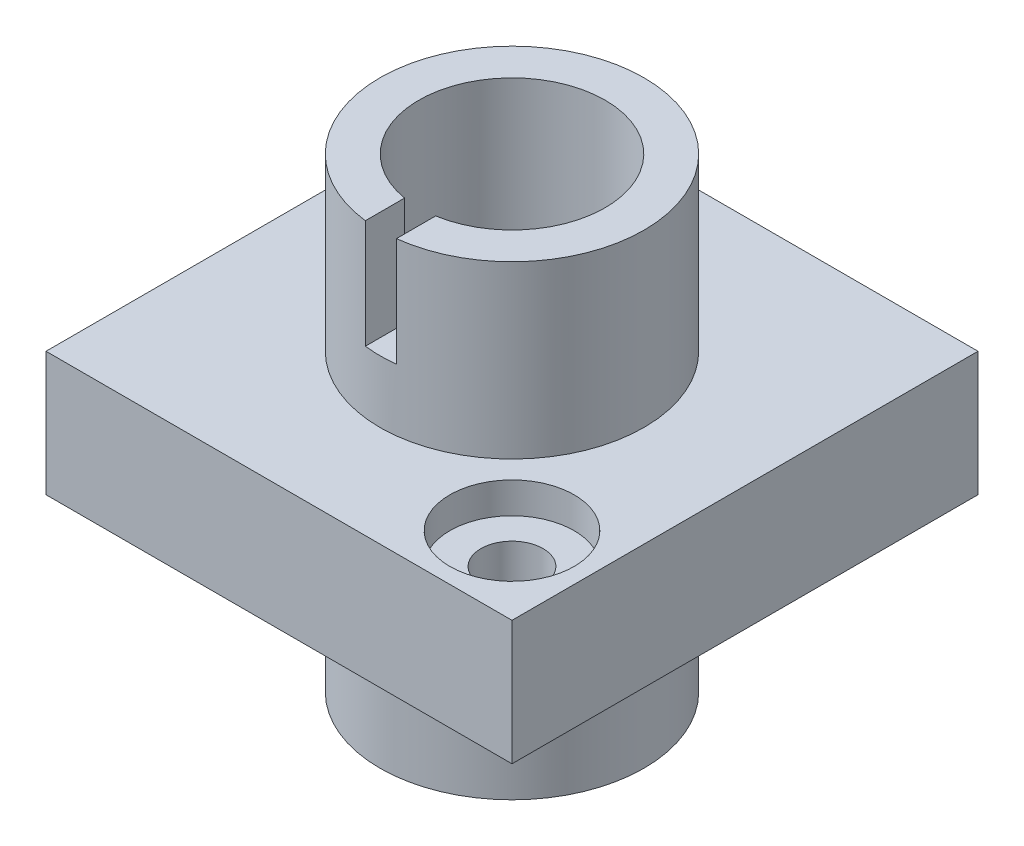
ISO-10303-21;
HEADER;
FILE_DESCRIPTION(('STEP AP214'),'2;1');
FILE_NAME('part.step','',(''),(''),'','','');
FILE_SCHEMA(('AUTOMOTIVE_DESIGN { 1 0 10303 214 1 1 1 1 }'));
ENDSEC;
DATA;
#1=APPLICATION_CONTEXT('core data for automotive mechanical design processes');
#2=APPLICATION_PROTOCOL_DEFINITION('international standard','automotive_design',2000,#1);
#3=PRODUCT_CONTEXT('',#1,'mechanical');
#4=PRODUCT('Part','Part','',(#3));
#5=PRODUCT_RELATED_PRODUCT_CATEGORY('part','',(#4));
#6=PRODUCT_DEFINITION_FORMATION('','',#4);
#7=PRODUCT_DEFINITION_CONTEXT('part definition',#1,'design');
#8=PRODUCT_DEFINITION('design','',#6,#7);
#9=PRODUCT_DEFINITION_SHAPE('','',#8);
#10=(LENGTH_UNIT() NAMED_UNIT(*) SI_UNIT(.MILLI.,.METRE.));
#11=(NAMED_UNIT(*) PLANE_ANGLE_UNIT() SI_UNIT($,.RADIAN.));
#12=(NAMED_UNIT(*) SI_UNIT($,.STERADIAN.) SOLID_ANGLE_UNIT());
#13=UNCERTAINTY_MEASURE_WITH_UNIT(LENGTH_MEASURE(1.E-05),#10,'distance_accuracy_value','');
#14=(GEOMETRIC_REPRESENTATION_CONTEXT(3) GLOBAL_UNCERTAINTY_ASSIGNED_CONTEXT((#13)) GLOBAL_UNIT_ASSIGNED_CONTEXT((#10,
#11,#12)) REPRESENTATION_CONTEXT('',''));
#15=CARTESIAN_POINT('',(0.,0.,0.));
#16=DIRECTION('',(0.,0.,1.));
#17=DIRECTION('',(1.,0.,0.));
#18=AXIS2_PLACEMENT_3D('',#15,#16,#17);
#19=CARTESIAN_POINT('',(-5.,-5.5,-5.));
#20=DIRECTION('',(0.,1.,0.));
#21=DIRECTION('',(0.,0.,1.));
#22=AXIS2_PLACEMENT_3D('',#19,#20,#21);
#23=CYLINDRICAL_SURFACE('',#22,1.);
#24=CARTESIAN_POINT('',(-5.,0.,-5.));
#25=DIRECTION('',(0.,1.,0.));
#26=DIRECTION('',(0.,0.,1.));
#27=AXIS2_PLACEMENT_3D('',#24,#25,#26);
#28=CIRCLE('',#27,1.);
#29=CARTESIAN_POINT('',(-5.,0.,-4.));
#30=VERTEX_POINT('',#29);
#31=EDGE_CURVE('E141',#30,#30,#28,.T.);
#32=ORIENTED_EDGE('',*,*,#31,.F.);
#33=EDGE_LOOP('',(#32));
#34=FACE_BOUND('',#33,.T.);
#35=CARTESIAN_POINT('',(-5.,3.,-5.));
#36=DIRECTION('',(0.,1.,0.));
#37=DIRECTION('',(0.,0.,1.));
#38=AXIS2_PLACEMENT_3D('',#35,#36,#37);
#39=CIRCLE('',#38,1.);
#40=CARTESIAN_POINT('',(-5.,3.,-4.));
#41=VERTEX_POINT('',#40);
#42=EDGE_CURVE('E129',#41,#41,#39,.F.);
#43=ORIENTED_EDGE('',*,*,#42,.F.);
#44=EDGE_LOOP('',(#43));
#45=FACE_BOUND('',#44,.T.);
#46=ADVANCED_FACE('F35',(#34,#45),#23,.F.);
#47=CARTESIAN_POINT('',(5.,-5.5,5.));
#48=DIRECTION('',(0.,1.,0.));
#49=DIRECTION('',(0.,0.,1.));
#50=AXIS2_PLACEMENT_3D('',#47,#48,#49);
#51=CYLINDRICAL_SURFACE('',#50,1.);
#52=CARTESIAN_POINT('',(5.,0.,5.));
#53=DIRECTION('',(0.,1.,0.));
#54=DIRECTION('',(0.,0.,1.));
#55=AXIS2_PLACEMENT_3D('',#52,#53,#54);
#56=CIRCLE('',#55,1.);
#57=CARTESIAN_POINT('',(5.,0.,6.));
#58=VERTEX_POINT('',#57);
#59=EDGE_CURVE('E185',#58,#58,#56,.T.);
#60=ORIENTED_EDGE('',*,*,#59,.F.);
#61=EDGE_LOOP('',(#60));
#62=FACE_BOUND('',#61,.T.);
#63=CARTESIAN_POINT('',(5.,3.,5.));
#64=DIRECTION('',(0.,1.,0.));
#65=DIRECTION('',(0.,0.,1.));
#66=AXIS2_PLACEMENT_3D('',#63,#64,#65);
#67=CIRCLE('',#66,1.);
#68=CARTESIAN_POINT('',(5.,3.,6.));
#69=VERTEX_POINT('',#68);
#70=EDGE_CURVE('E136',#69,#69,#67,.F.);
#71=ORIENTED_EDGE('',*,*,#70,.F.);
#72=EDGE_LOOP('',(#71));
#73=FACE_BOUND('',#72,.T.);
#74=ADVANCED_FACE('F219',(#62,#73),#51,.F.);
#75=CARTESIAN_POINT('',(-7.5,4.,7.5));
#76=DIRECTION('',(0.,1.,0.));
#77=DIRECTION('',(0.,0.,1.));
#78=AXIS2_PLACEMENT_3D('',#75,#76,#77);
#79=PLANE('',#78);
#80=CARTESIAN_POINT('',(-5.,4.,-5.));
#81=DIRECTION('',(0.,1.,0.));
#82=DIRECTION('',(0.,0.,1.));
#83=AXIS2_PLACEMENT_3D('',#80,#81,#82);
#84=CIRCLE('',#83,2.);
#85=CARTESIAN_POINT('',(-5.,4.,-3.));
#86=VERTEX_POINT('',#85);
#87=EDGE_CURVE('E120',#86,#86,#84,.T.);
#88=ORIENTED_EDGE('',*,*,#87,.F.);
#89=EDGE_LOOP('',(#88));
#90=FACE_BOUND('',#89,.T.);
#91=CARTESIAN_POINT('',(5.,4.,5.));
#92=DIRECTION('',(0.,1.,0.));
#93=DIRECTION('',(0.,0.,1.));
#94=AXIS2_PLACEMENT_3D('',#91,#92,#93);
#95=CIRCLE('',#94,2.);
#96=CARTESIAN_POINT('',(5.,4.,7.));
#97=VERTEX_POINT('',#96);
#98=EDGE_CURVE('E130',#97,#97,#95,.T.);
#99=ORIENTED_EDGE('',*,*,#98,.F.);
#100=EDGE_LOOP('',(#99));
#101=FACE_BOUND('',#100,.T.);
#102=DIRECTION('',(0.,0.,1.));
#103=VECTOR('',#102,1.);
#104=CARTESIAN_POINT('',(-7.5,4.,-7.5));
#105=LINE('',#104,#103);
#106=CARTESIAN_POINT('',(-7.5,4.,-7.5));
#107=VERTEX_POINT('',#106);
#108=CARTESIAN_POINT('',(-7.5,4.,7.5));
#109=VERTEX_POINT('',#108);
#110=EDGE_CURVE('E160',#107,#109,#105,.T.);
#111=ORIENTED_EDGE('',*,*,#110,.T.);
#112=DIRECTION('',(1.,0.,0.));
#113=VECTOR('',#112,1.);
#114=CARTESIAN_POINT('',(-7.5,4.,7.5));
#115=LINE('',#114,#113);
#116=CARTESIAN_POINT('',(7.5,4.,7.5));
#117=VERTEX_POINT('',#116);
#118=EDGE_CURVE('E162',#109,#117,#115,.T.);
#119=ORIENTED_EDGE('',*,*,#118,.T.);
#120=DIRECTION('',(0.,0.,-1.));
#121=VECTOR('',#120,1.);
#122=CARTESIAN_POINT('',(7.5,4.,-7.5));
#123=LINE('',#122,#121);
#124=CARTESIAN_POINT('',(7.5,4.,-7.5));
#125=VERTEX_POINT('',#124);
#126=EDGE_CURVE('E164',#117,#125,#123,.T.);
#127=ORIENTED_EDGE('',*,*,#126,.T.);
#128=DIRECTION('',(-1.,0.,0.));
#129=VECTOR('',#128,1.);
#130=CARTESIAN_POINT('',(-7.5,4.,-7.5));
#131=LINE('',#130,#129);
#132=EDGE_CURVE('E58',#125,#107,#131,.T.);
#133=ORIENTED_EDGE('',*,*,#132,.T.);
#134=EDGE_LOOP('',(#111,#119,#127,#133));
#135=FACE_BOUND('',#134,.T.);
#136=CARTESIAN_POINT('',(0.,4.,0.));
#137=DIRECTION('',(0.,1.,0.));
#138=DIRECTION('',(0.,0.,1.));
#139=AXIS2_PLACEMENT_3D('',#136,#137,#138);
#140=CIRCLE('',#139,4.25);
#141=CARTESIAN_POINT('',(0.,4.,4.25));
#142=VERTEX_POINT('',#141);
#143=EDGE_CURVE('E148',#142,#142,#140,.F.);
#144=ORIENTED_EDGE('',*,*,#143,.T.);
#145=EDGE_LOOP('',(#144));
#146=FACE_BOUND('',#145,.T.);
#147=ADVANCED_FACE('F225',(#90,#101,#135,#146),#79,.T.);
#148=CARTESIAN_POINT('',(-7.5,0.,7.5));
#149=DIRECTION('',(0.,1.,0.));
#150=DIRECTION('',(0.,0.,1.));
#151=AXIS2_PLACEMENT_3D('',#148,#149,#150);
#152=PLANE('',#151);
#153=ORIENTED_EDGE('',*,*,#59,.T.);
#154=EDGE_LOOP('',(#153));
#155=FACE_BOUND('',#154,.T.);
#156=ORIENTED_EDGE('',*,*,#31,.T.);
#157=EDGE_LOOP('',(#156));
#158=FACE_BOUND('',#157,.T.);
#159=DIRECTION('',(0.,0.,1.));
#160=VECTOR('',#159,1.);
#161=CARTESIAN_POINT('',(-7.5,0.,-7.5));
#162=LINE('',#161,#160);
#163=CARTESIAN_POINT('',(-7.5,0.,-7.5));
#164=VERTEX_POINT('',#163);
#165=CARTESIAN_POINT('',(-7.5,0.,7.5));
#166=VERTEX_POINT('',#165);
#167=EDGE_CURVE('E151',#164,#166,#162,.T.);
#168=ORIENTED_EDGE('',*,*,#167,.F.);
#169=DIRECTION('',(-1.,0.,0.));
#170=VECTOR('',#169,1.);
#171=CARTESIAN_POINT('',(-7.5,0.,-7.5));
#172=LINE('',#171,#170);
#173=CARTESIAN_POINT('',(7.5,0.,-7.5));
#174=VERTEX_POINT('',#173);
#175=EDGE_CURVE('E158',#174,#164,#172,.T.);
#176=ORIENTED_EDGE('',*,*,#175,.F.);
#177=DIRECTION('',(0.,0.,-1.));
#178=VECTOR('',#177,1.);
#179=CARTESIAN_POINT('',(7.5,0.,-7.5));
#180=LINE('',#179,#178);
#181=CARTESIAN_POINT('',(7.5,0.,7.5));
#182=VERTEX_POINT('',#181);
#183=EDGE_CURVE('E156',#182,#174,#180,.T.);
#184=ORIENTED_EDGE('',*,*,#183,.F.);
#185=DIRECTION('',(1.,0.,0.));
#186=VECTOR('',#185,1.);
#187=CARTESIAN_POINT('',(-7.5,0.,7.5));
#188=LINE('',#187,#186);
#189=EDGE_CURVE('E154',#166,#182,#188,.T.);
#190=ORIENTED_EDGE('',*,*,#189,.F.);
#191=EDGE_LOOP('',(#168,#176,#184,#190));
#192=FACE_BOUND('',#191,.T.);
#193=CARTESIAN_POINT('',(0.,0.,0.));
#194=DIRECTION('',(0.,1.,0.));
#195=DIRECTION('',(0.,0.,1.));
#196=AXIS2_PLACEMENT_3D('',#193,#194,#195);
#197=CIRCLE('',#196,4.25);
#198=CARTESIAN_POINT('',(0.,0.,4.25));
#199=VERTEX_POINT('',#198);
#200=EDGE_CURVE('E179',#199,#199,#197,.F.);
#201=ORIENTED_EDGE('',*,*,#200,.F.);
#202=EDGE_LOOP('',(#201));
#203=FACE_BOUND('',#202,.T.);
#204=ADVANCED_FACE('F249',(#155,#158,#192,#203),#152,.F.);
#205=CARTESIAN_POINT('',(-7.5,4.,-7.5));
#206=DIRECTION('',(1.,0.,0.));
#207=DIRECTION('',(0.,0.,-1.));
#208=AXIS2_PLACEMENT_3D('',#205,#206,#207);
#209=PLANE('',#208);
#210=ORIENTED_EDGE('',*,*,#167,.T.);
#211=DIRECTION('',(0.,-1.,0.));
#212=VECTOR('',#211,1.);
#213=CARTESIAN_POINT('',(-7.5,4.,7.5));
#214=LINE('',#213,#212);
#215=EDGE_CURVE('E176',#109,#166,#214,.T.);
#216=ORIENTED_EDGE('',*,*,#215,.F.);
#217=ORIENTED_EDGE('',*,*,#110,.F.);
#218=DIRECTION('',(0.,-1.,0.));
#219=VECTOR('',#218,1.);
#220=CARTESIAN_POINT('',(-7.5,4.,-7.5));
#221=LINE('',#220,#219);
#222=EDGE_CURVE('E167',#107,#164,#221,.T.);
#223=ORIENTED_EDGE('',*,*,#222,.T.);
#224=EDGE_LOOP('',(#210,#216,#217,#223));
#225=FACE_BOUND('',#224,.T.);
#226=ADVANCED_FACE('F37',(#225),#209,.F.);
#227=CARTESIAN_POINT('',(-7.5,4.,7.5));
#228=DIRECTION('',(0.,0.,-1.));
#229=DIRECTION('',(-1.,0.,0.));
#230=AXIS2_PLACEMENT_3D('',#227,#228,#229);
#231=PLANE('',#230);
#232=ORIENTED_EDGE('',*,*,#189,.T.);
#233=DIRECTION('',(0.,-1.,0.));
#234=VECTOR('',#233,1.);
#235=CARTESIAN_POINT('',(7.5,4.,7.5));
#236=LINE('',#235,#234);
#237=EDGE_CURVE('E173',#117,#182,#236,.T.);
#238=ORIENTED_EDGE('',*,*,#237,.F.);
#239=ORIENTED_EDGE('',*,*,#118,.F.);
#240=ORIENTED_EDGE('',*,*,#215,.T.);
#241=EDGE_LOOP('',(#232,#238,#239,#240));
#242=FACE_BOUND('',#241,.T.);
#243=ADVANCED_FACE('F257',(#242),#231,.F.);
#244=CARTESIAN_POINT('',(7.5,4.,-7.5));
#245=DIRECTION('',(-1.,0.,0.));
#246=DIRECTION('',(0.,0.,1.));
#247=AXIS2_PLACEMENT_3D('',#244,#245,#246);
#248=PLANE('',#247);
#249=ORIENTED_EDGE('',*,*,#183,.T.);
#250=DIRECTION('',(0.,-1.,0.));
#251=VECTOR('',#250,1.);
#252=CARTESIAN_POINT('',(7.5,4.,-7.5));
#253=LINE('',#252,#251);
#254=EDGE_CURVE('E170',#125,#174,#253,.T.);
#255=ORIENTED_EDGE('',*,*,#254,.F.);
#256=ORIENTED_EDGE('',*,*,#126,.F.);
#257=ORIENTED_EDGE('',*,*,#237,.T.);
#258=EDGE_LOOP('',(#249,#255,#256,#257));
#259=FACE_BOUND('',#258,.T.);
#260=ADVANCED_FACE('F240',(#259),#248,.F.);
#261=CARTESIAN_POINT('',(-7.5,4.,-7.5));
#262=DIRECTION('',(0.,0.,1.));
#263=DIRECTION('',(1.,0.,0.));
#264=AXIS2_PLACEMENT_3D('',#261,#262,#263);
#265=PLANE('',#264);
#266=ORIENTED_EDGE('',*,*,#175,.T.);
#267=ORIENTED_EDGE('',*,*,#222,.F.);
#268=ORIENTED_EDGE('',*,*,#132,.F.);
#269=ORIENTED_EDGE('',*,*,#254,.T.);
#270=EDGE_LOOP('',(#266,#267,#268,#269));
#271=FACE_BOUND('',#270,.T.);
#272=ADVANCED_FACE('F233',(#271),#265,.F.);
#273=CARTESIAN_POINT('',(-7.5,-5.5,7.5));
#274=DIRECTION('',(0.,1.,0.));
#275=DIRECTION('',(0.,0.,1.));
#276=AXIS2_PLACEMENT_3D('',#273,#274,#275);
#277=PLANE('',#276);
#278=CARTESIAN_POINT('',(0.,-5.5,0.));
#279=DIRECTION('',(0.,-1.,0.));
#280=DIRECTION('',(0.,0.,-1.));
#281=AXIS2_PLACEMENT_3D('',#278,#279,#280);
#282=CIRCLE('',#281,3.);
#283=CARTESIAN_POINT('',(0.,-5.5,-3.));
#284=VERTEX_POINT('',#283);
#285=EDGE_CURVE('E137',#284,#284,#282,.T.);
#286=ORIENTED_EDGE('',*,*,#285,.F.);
#287=EDGE_LOOP('',(#286));
#288=FACE_BOUND('',#287,.T.);
#289=CARTESIAN_POINT('',(0.,-5.5,0.));
#290=DIRECTION('',(0.,1.,0.));
#291=DIRECTION('',(0.,0.,1.));
#292=AXIS2_PLACEMENT_3D('',#289,#290,#291);
#293=CIRCLE('',#292,4.25);
#294=CARTESIAN_POINT('',(0.,-5.5,4.25));
#295=VERTEX_POINT('',#294);
#296=EDGE_CURVE('E144',#295,#295,#293,.F.);
#297=ORIENTED_EDGE('',*,*,#296,.T.);
#298=EDGE_LOOP('',(#297));
#299=FACE_BOUND('',#298,.T.);
#300=ADVANCED_FACE('F231',(#288,#299),#277,.F.);
#301=CARTESIAN_POINT('',(0.,9.5,0.));
#302=DIRECTION('',(0.,-1.,0.));
#303=DIRECTION('',(0.,0.,-1.));
#304=AXIS2_PLACEMENT_3D('',#301,#302,#303);
#305=CYLINDRICAL_SURFACE('',#304,4.25);
#306=ORIENTED_EDGE('',*,*,#296,.F.);
#307=EDGE_LOOP('',(#306));
#308=FACE_BOUND('',#307,.T.);
#309=ORIENTED_EDGE('',*,*,#200,.T.);
#310=EDGE_LOOP('',(#309));
#311=FACE_BOUND('',#310,.T.);
#312=ADVANCED_FACE('F215',(#308,#311),#305,.T.);
#313=CARTESIAN_POINT('',(0.,9.5,0.));
#314=DIRECTION('',(0.,1.,0.));
#315=DIRECTION('',(0.,0.,1.));
#316=AXIS2_PLACEMENT_3D('',#313,#314,#315);
#317=CIRCLE('',#316,4.25);
#318=CARTESIAN_POINT('',(0.5,9.5,4.22048575403353));
#319=VERTEX_POINT('',#318);
#320=CARTESIAN_POINT('',(-0.5,9.5,4.22048575403353));
#321=VERTEX_POINT('',#320);
#322=EDGE_CURVE('E119',#319,#321,#317,.T.);
#323=ORIENTED_EDGE('',*,*,#322,.F.);
#324=DIRECTION('',(0.,-1.,0.));
#325=VECTOR('',#324,1.);
#326=CARTESIAN_POINT('',(0.5,9.5,4.22048575403353));
#327=LINE('',#326,#325);
#328=CARTESIAN_POINT('',(0.5,6.,4.22048575403353));
#329=VERTEX_POINT('',#328);
#330=EDGE_CURVE('E111',#319,#329,#327,.T.);
#331=ORIENTED_EDGE('',*,*,#330,.T.);
#332=CARTESIAN_POINT('',(0.,6.,0.));
#333=DIRECTION('',(0.,1.,0.));
#334=DIRECTION('',(0.,0.,1.));
#335=AXIS2_PLACEMENT_3D('',#332,#333,#334);
#336=CIRCLE('',#335,4.25);
#337=CARTESIAN_POINT('',(-0.5,6.,4.22048575403353));
#338=VERTEX_POINT('',#337);
#339=EDGE_CURVE('E100',#338,#329,#336,.T.);
#340=ORIENTED_EDGE('',*,*,#339,.F.);
#341=DIRECTION('',(0.,-1.,0.));
#342=VECTOR('',#341,1.);
#343=CARTESIAN_POINT('',(-0.5,9.5,4.22048575403353));
#344=LINE('',#343,#342);
#345=EDGE_CURVE('E107',#338,#321,#344,.F.);
#346=ORIENTED_EDGE('',*,*,#345,.T.);
#347=EDGE_LOOP('',(#323,#331,#340,#346));
#348=FACE_BOUND('',#347,.T.);
#349=ORIENTED_EDGE('',*,*,#143,.F.);
#350=EDGE_LOOP('',(#349));
#351=FACE_BOUND('',#350,.T.);
#352=ADVANCED_FACE('F116',(#348,#351),#305,.T.);
#353=CARTESIAN_POINT('',(0.,9.5,0.));
#354=DIRECTION('',(0.,1.,0.));
#355=DIRECTION('',(0.,0.,1.));
#356=AXIS2_PLACEMENT_3D('',#353,#354,#355);
#357=PLANE('',#356);
#358=DIRECTION('',(0.,0.,-1.));
#359=VECTOR('',#358,1.);
#360=CARTESIAN_POINT('',(0.5,9.5,2.17696629213483));
#361=LINE('',#360,#359);
#362=CARTESIAN_POINT('',(0.5,9.5,2.95803989154981));
#363=VERTEX_POINT('',#362);
#364=EDGE_CURVE('E203',#319,#363,#361,.T.);
#365=ORIENTED_EDGE('',*,*,#364,.F.);
#366=ORIENTED_EDGE('',*,*,#322,.T.);
#367=DIRECTION('',(0.,0.,1.));
#368=VECTOR('',#367,1.);
#369=CARTESIAN_POINT('',(-0.5,9.5,2.17696629213483));
#370=LINE('',#369,#368);
#371=CARTESIAN_POINT('',(-0.5,9.5,2.95803989154981));
#372=VERTEX_POINT('',#371);
#373=EDGE_CURVE('E200',#372,#321,#370,.T.);
#374=ORIENTED_EDGE('',*,*,#373,.F.);
#375=CARTESIAN_POINT('',(0.,9.5,0.));
#376=DIRECTION('',(0.,-1.,0.));
#377=DIRECTION('',(0.,0.,-1.));
#378=AXIS2_PLACEMENT_3D('',#375,#376,#377);
#379=CIRCLE('',#378,3.);
#380=EDGE_CURVE('E140',#372,#363,#379,.T.);
#381=ORIENTED_EDGE('',*,*,#380,.T.);
#382=EDGE_LOOP('',(#365,#366,#374,#381));
#383=FACE_BOUND('',#382,.T.);
#384=ADVANCED_FACE('F202',(#383),#357,.T.);
#385=CARTESIAN_POINT('',(0.,9.5,0.));
#386=DIRECTION('',(0.,-1.,0.));
#387=DIRECTION('',(0.,0.,-1.));
#388=AXIS2_PLACEMENT_3D('',#385,#386,#387);
#389=CYLINDRICAL_SURFACE('',#388,3.);
#390=CARTESIAN_POINT('',(0.,6.,0.));
#391=DIRECTION('',(0.,1.,0.));
#392=DIRECTION('',(0.,0.,1.));
#393=AXIS2_PLACEMENT_3D('',#390,#391,#392);
#394=CIRCLE('',#393,3.);
#395=CARTESIAN_POINT('',(0.5,6.,2.95803989154981));
#396=VERTEX_POINT('',#395);
#397=CARTESIAN_POINT('',(-0.5,6.,2.95803989154981));
#398=VERTEX_POINT('',#397);
#399=EDGE_CURVE('E182',#396,#398,#394,.F.);
#400=ORIENTED_EDGE('',*,*,#399,.F.);
#401=DIRECTION('',(0.,-1.,0.));
#402=VECTOR('',#401,1.);
#403=CARTESIAN_POINT('',(0.5,9.5,2.95803989154981));
#404=LINE('',#403,#402);
#405=EDGE_CURVE('E13',#396,#363,#404,.F.);
#406=ORIENTED_EDGE('',*,*,#405,.T.);
#407=ORIENTED_EDGE('',*,*,#380,.F.);
#408=DIRECTION('',(0.,-1.,0.));
#409=VECTOR('',#408,1.);
#410=CARTESIAN_POINT('',(-0.5,9.5,2.95803989154981));
#411=LINE('',#410,#409);
#412=EDGE_CURVE('E43',#372,#398,#411,.T.);
#413=ORIENTED_EDGE('',*,*,#412,.T.);
#414=EDGE_LOOP('',(#400,#406,#407,#413));
#415=FACE_BOUND('',#414,.T.);
#416=ORIENTED_EDGE('',*,*,#285,.T.);
#417=EDGE_LOOP('',(#416));
#418=FACE_BOUND('',#417,.T.);
#419=ADVANCED_FACE('F195',(#415,#418),#389,.F.);
#420=CARTESIAN_POINT('',(5.,3.,5.));
#421=DIRECTION('',(0.,1.,0.));
#422=DIRECTION('',(0.,0.,1.));
#423=AXIS2_PLACEMENT_3D('',#420,#421,#422);
#424=PLANE('',#423);
#425=CARTESIAN_POINT('',(5.,3.,5.));
#426=DIRECTION('',(0.,1.,0.));
#427=DIRECTION('',(0.,0.,1.));
#428=AXIS2_PLACEMENT_3D('',#425,#426,#427);
#429=CIRCLE('',#428,2.);
#430=CARTESIAN_POINT('',(5.,3.,7.));
#431=VERTEX_POINT('',#430);
#432=EDGE_CURVE('E133',#431,#431,#429,.T.);
#433=ORIENTED_EDGE('',*,*,#432,.T.);
#434=EDGE_LOOP('',(#433));
#435=FACE_BOUND('',#434,.T.);
#436=ORIENTED_EDGE('',*,*,#70,.T.);
#437=EDGE_LOOP('',(#436));
#438=FACE_BOUND('',#437,.T.);
#439=ADVANCED_FACE('F213',(#435,#438),#424,.T.);
#440=CARTESIAN_POINT('',(5.,3.,5.));
#441=DIRECTION('',(0.,1.,0.));
#442=DIRECTION('',(0.,0.,1.));
#443=AXIS2_PLACEMENT_3D('',#440,#441,#442);
#444=CYLINDRICAL_SURFACE('',#443,2.);
#445=ORIENTED_EDGE('',*,*,#432,.F.);
#446=EDGE_LOOP('',(#445));
#447=FACE_BOUND('',#446,.T.);
#448=ORIENTED_EDGE('',*,*,#98,.T.);
#449=EDGE_LOOP('',(#448));
#450=FACE_BOUND('',#449,.T.);
#451=ADVANCED_FACE('F331',(#447,#450),#444,.F.);
#452=CARTESIAN_POINT('',(-5.,3.,-5.));
#453=DIRECTION('',(0.,1.,0.));
#454=DIRECTION('',(0.,0.,1.));
#455=AXIS2_PLACEMENT_3D('',#452,#453,#454);
#456=PLANE('',#455);
#457=CARTESIAN_POINT('',(-5.,3.,-5.));
#458=DIRECTION('',(0.,1.,0.));
#459=DIRECTION('',(0.,0.,1.));
#460=AXIS2_PLACEMENT_3D('',#457,#458,#459);
#461=CIRCLE('',#460,2.);
#462=CARTESIAN_POINT('',(-5.,3.,-3.));
#463=VERTEX_POINT('',#462);
#464=EDGE_CURVE('E123',#463,#463,#461,.T.);
#465=ORIENTED_EDGE('',*,*,#464,.T.);
#466=EDGE_LOOP('',(#465));
#467=FACE_BOUND('',#466,.T.);
#468=ORIENTED_EDGE('',*,*,#42,.T.);
#469=EDGE_LOOP('',(#468));
#470=FACE_BOUND('',#469,.T.);
#471=ADVANCED_FACE('F341',(#467,#470),#456,.T.);
#472=CARTESIAN_POINT('',(-5.,3.,-5.));
#473=DIRECTION('',(0.,1.,0.));
#474=DIRECTION('',(0.,0.,1.));
#475=AXIS2_PLACEMENT_3D('',#472,#473,#474);
#476=CYLINDRICAL_SURFACE('',#475,2.);
#477=ORIENTED_EDGE('',*,*,#464,.F.);
#478=EDGE_LOOP('',(#477));
#479=FACE_BOUND('',#478,.T.);
#480=ORIENTED_EDGE('',*,*,#87,.T.);
#481=EDGE_LOOP('',(#480));
#482=FACE_BOUND('',#481,.T.);
#483=ADVANCED_FACE('F350',(#479,#482),#476,.F.);
#484=CARTESIAN_POINT('',(0.5,0.885648428825811,2.17696629213483));
#485=DIRECTION('',(1.,0.,0.));
#486=DIRECTION('',(0.,0.,-1.));
#487=AXIS2_PLACEMENT_3D('',#484,#485,#486);
#488=PLANE('',#487);
#489=ORIENTED_EDGE('',*,*,#364,.T.);
#490=ORIENTED_EDGE('',*,*,#405,.F.);
#491=DIRECTION('',(0.,0.,1.));
#492=VECTOR('',#491,1.);
#493=CARTESIAN_POINT('',(0.5,6.,2.17696629213483));
#494=LINE('',#493,#492);
#495=EDGE_CURVE('E50',#396,#329,#494,.T.);
#496=ORIENTED_EDGE('',*,*,#495,.T.);
#497=ORIENTED_EDGE('',*,*,#330,.F.);
#498=EDGE_LOOP('',(#489,#490,#496,#497));
#499=FACE_BOUND('',#498,.T.);
#500=ADVANCED_FACE('F110',(#499),#488,.F.);
#501=CARTESIAN_POINT('',(-0.5,0.885648428825811,2.17696629213483));
#502=DIRECTION('',(-1.,0.,0.));
#503=DIRECTION('',(0.,0.,1.));
#504=AXIS2_PLACEMENT_3D('',#501,#502,#503);
#505=PLANE('',#504);
#506=DIRECTION('',(0.,0.,-1.));
#507=VECTOR('',#506,1.);
#508=CARTESIAN_POINT('',(-0.5,6.,2.17696629213483));
#509=LINE('',#508,#507);
#510=EDGE_CURVE('E103',#338,#398,#509,.T.);
#511=ORIENTED_EDGE('',*,*,#510,.T.);
#512=ORIENTED_EDGE('',*,*,#412,.F.);
#513=ORIENTED_EDGE('',*,*,#373,.T.);
#514=ORIENTED_EDGE('',*,*,#345,.F.);
#515=EDGE_LOOP('',(#511,#512,#513,#514));
#516=FACE_BOUND('',#515,.T.);
#517=ADVANCED_FACE('F199',(#516),#505,.F.);
#518=CARTESIAN_POINT('',(-7.5,6.,7.5));
#519=DIRECTION('',(0.,1.,0.));
#520=DIRECTION('',(0.,0.,1.));
#521=AXIS2_PLACEMENT_3D('',#518,#519,#520);
#522=PLANE('',#521);
#523=ORIENTED_EDGE('',*,*,#339,.T.);
#524=ORIENTED_EDGE('',*,*,#495,.F.);
#525=ORIENTED_EDGE('',*,*,#399,.T.);
#526=ORIENTED_EDGE('',*,*,#510,.F.);
#527=EDGE_LOOP('',(#523,#524,#525,#526));
#528=FACE_BOUND('',#527,.T.);
#529=ADVANCED_FACE('F101',(#528),#522,.T.);
#530=CLOSED_SHELL('',(#46,#74,#147,#204,#226,#243,#260,#272,#300,#312,#352,#384,#419,#439,#451,
#471,#483,#500,#517,#529));
#531=MANIFOLD_SOLID_BREP('B2',#530);
#532=ADVANCED_BREP_SHAPE_REPRESENTATION('',(#18,#531),#14);
#533=SHAPE_DEFINITION_REPRESENTATION(#9,#532);
ENDSEC;
END-ISO-10303-21;
